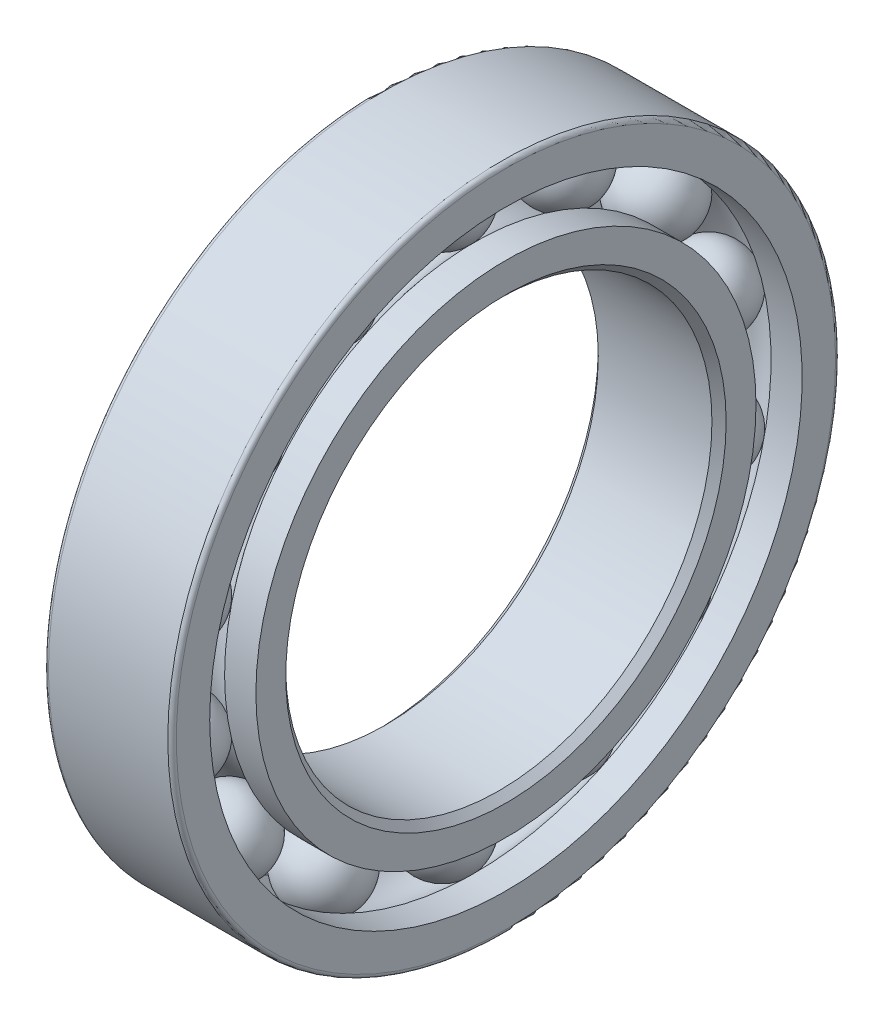
ISO-10303-21;
HEADER;
FILE_DESCRIPTION(('STEP AP214'),'2;1');
FILE_NAME('part.step','',(''),(''),'','','');
FILE_SCHEMA(('AUTOMOTIVE_DESIGN { 1 0 10303 214 1 1 1 1 }'));
ENDSEC;
DATA;
#1=APPLICATION_CONTEXT('core data for automotive mechanical design processes');
#2=APPLICATION_PROTOCOL_DEFINITION('international standard','automotive_design',2000,#1);
#3=PRODUCT_CONTEXT('',#1,'mechanical');
#4=PRODUCT('Part','Part','',(#3));
#5=PRODUCT_RELATED_PRODUCT_CATEGORY('part','',(#4));
#6=PRODUCT_DEFINITION_FORMATION('','',#4);
#7=PRODUCT_DEFINITION_CONTEXT('part definition',#1,'design');
#8=PRODUCT_DEFINITION('design','',#6,#7);
#9=PRODUCT_DEFINITION_SHAPE('','',#8);
#10=(LENGTH_UNIT() NAMED_UNIT(*) SI_UNIT(.MILLI.,.METRE.));
#11=(NAMED_UNIT(*) PLANE_ANGLE_UNIT() SI_UNIT($,.RADIAN.));
#12=(NAMED_UNIT(*) SI_UNIT($,.STERADIAN.) SOLID_ANGLE_UNIT());
#13=UNCERTAINTY_MEASURE_WITH_UNIT(LENGTH_MEASURE(1.E-05),#10,'distance_accuracy_value','');
#14=(GEOMETRIC_REPRESENTATION_CONTEXT(3) GLOBAL_UNCERTAINTY_ASSIGNED_CONTEXT((#13)) GLOBAL_UNIT_ASSIGNED_CONTEXT((#10,
#11,#12)) REPRESENTATION_CONTEXT('',''));
#15=CARTESIAN_POINT('',(0.,0.,0.));
#16=DIRECTION('',(0.,0.,1.));
#17=DIRECTION('',(1.,0.,0.));
#18=AXIS2_PLACEMENT_3D('',#15,#16,#17);
#19=CARTESIAN_POINT('',(0.,17.3346410184427,8.34792314062159));
#20=DIRECTION('',(-1.,0.,0.));
#21=DIRECTION('',(0.,0.900968867902425,0.433883739117546));
#22=AXIS2_PLACEMENT_3D('',#19,#20,#21);
#23=SPHERICAL_SURFACE('',#22,2.8);
#24=CARTESIAN_POINT('',(-2.8,17.3346410184427,8.34792314062159));
#25=VERTEX_POINT('',#24);
#26=VERTEX_LOOP('',#25);
#27=FACE_BOUND('',#26,.T.);
#28=ADVANCED_FACE('F38',(#27),#23,.T.);
#29=CLOSED_SHELL('',(#28));
#30=MANIFOLD_SOLID_BREP('B2',#29);
#31=CARTESIAN_POINT('',(0.,11.9959437877622,15.0424377226847));
#32=DIRECTION('',(-1.,0.,0.));
#33=DIRECTION('',(0.,0.623489801858743,0.781831482468022));
#34=AXIS2_PLACEMENT_3D('',#31,#32,#33);
#35=SPHERICAL_SURFACE('',#34,2.8);
#36=CARTESIAN_POINT('',(-2.8,11.9959437877622,15.0424377226847));
#37=VERTEX_POINT('',#36);
#38=VERTEX_LOOP('',#37);
#39=FACE_BOUND('',#38,.T.);
#40=ADVANCED_FACE('F57',(#39),#35,.T.);
#41=CLOSED_SHELL('',(#40));
#42=MANIFOLD_SOLID_BREP('B6',#41);
#43=CARTESIAN_POINT('',(0.,4.28130276931969,18.7576130303782));
#44=DIRECTION('',(-1.,0.,0.));
#45=DIRECTION('',(0.,0.222520933956325,0.974927912181821));
#46=AXIS2_PLACEMENT_3D('',#43,#44,#45);
#47=SPHERICAL_SURFACE('',#46,2.8);
#48=CARTESIAN_POINT('',(-2.8,4.28130276931969,18.7576130303782));
#49=VERTEX_POINT('',#48);
#50=VERTEX_LOOP('',#49);
#51=FACE_BOUND('',#50,.T.);
#52=ADVANCED_FACE('F76',(#51),#47,.T.);
#53=CLOSED_SHELL('',(#52));
#54=MANIFOLD_SOLID_BREP('B34',#53);
#55=CARTESIAN_POINT('',(0.,-4.28130276931931,18.7576130303783));
#56=DIRECTION('',(-1.,0.,0.));
#57=DIRECTION('',(0.,-0.222520933956305,0.974927912181826));
#58=AXIS2_PLACEMENT_3D('',#55,#56,#57);
#59=SPHERICAL_SURFACE('',#58,2.8);
#60=CARTESIAN_POINT('',(-2.8,-4.28130276931931,18.7576130303783));
#61=VERTEX_POINT('',#60);
#62=VERTEX_LOOP('',#61);
#63=FACE_BOUND('',#62,.T.);
#64=ADVANCED_FACE('F95',(#63),#59,.T.);
#65=CLOSED_SHELL('',(#64));
#66=MANIFOLD_SOLID_BREP('B53',#65);
#67=CARTESIAN_POINT('',(0.,-11.9959437877619,15.042437722685));
#68=DIRECTION('',(-1.,0.,0.));
#69=DIRECTION('',(0.,-0.623489801858727,0.781831482468035));
#70=AXIS2_PLACEMENT_3D('',#67,#68,#69);
#71=SPHERICAL_SURFACE('',#70,2.8);
#72=CARTESIAN_POINT('',(-2.8,-11.9959437877619,15.042437722685));
#73=VERTEX_POINT('',#72);
#74=VERTEX_LOOP('',#73);
#75=FACE_BOUND('',#74,.T.);
#76=ADVANCED_FACE('F114',(#75),#71,.T.);
#77=CLOSED_SHELL('',(#76));
#78=MANIFOLD_SOLID_BREP('B72',#77);
#79=CARTESIAN_POINT('',(0.,-17.3346410184425,8.34792314062195));
#80=DIRECTION('',(-1.,0.,0.));
#81=DIRECTION('',(0.,-0.900968867902416,0.433883739117565));
#82=AXIS2_PLACEMENT_3D('',#79,#80,#81);
#83=SPHERICAL_SURFACE('',#82,2.8);
#84=CARTESIAN_POINT('',(-2.8,-17.3346410184425,8.34792314062195));
#85=VERTEX_POINT('',#84);
#86=VERTEX_LOOP('',#85);
#87=FACE_BOUND('',#86,.T.);
#88=ADVANCED_FACE('F133',(#87),#83,.T.);
#89=CLOSED_SHELL('',(#88));
#90=MANIFOLD_SOLID_BREP('B91',#89);
#91=CARTESIAN_POINT('',(0.,-19.24,0.));
#92=DIRECTION('',(-1.,0.,0.));
#93=DIRECTION('',(0.,-1.,0.));
#94=AXIS2_PLACEMENT_3D('',#91,#92,#93);
#95=SPHERICAL_SURFACE('',#94,2.8);
#96=CARTESIAN_POINT('',(-2.8,-19.24,0.));
#97=VERTEX_POINT('',#96);
#98=VERTEX_LOOP('',#97);
#99=FACE_BOUND('',#98,.T.);
#100=ADVANCED_FACE('F152',(#99),#95,.T.);
#101=CLOSED_SHELL('',(#100));
#102=MANIFOLD_SOLID_BREP('B110',#101);
#103=CARTESIAN_POINT('',(0.,-17.3346410184426,-8.34792314062171));
#104=DIRECTION('',(-1.,0.,0.));
#105=DIRECTION('',(0.,-0.900968867902422,-0.433883739117553));
#106=AXIS2_PLACEMENT_3D('',#103,#104,#105);
#107=SPHERICAL_SURFACE('',#106,2.8);
#108=CARTESIAN_POINT('',(-2.8,-17.3346410184426,-8.34792314062171));
#109=VERTEX_POINT('',#108);
#110=VERTEX_LOOP('',#109);
#111=FACE_BOUND('',#110,.T.);
#112=ADVANCED_FACE('F171',(#111),#107,.T.);
#113=CLOSED_SHELL('',(#112));
#114=MANIFOLD_SOLID_BREP('B129',#113);
#115=CARTESIAN_POINT('',(0.,-11.9959437877621,-15.0424377226848));
#116=DIRECTION('',(-1.,0.,0.));
#117=DIRECTION('',(0.,-0.623489801858737,-0.781831482468027));
#118=AXIS2_PLACEMENT_3D('',#115,#116,#117);
#119=SPHERICAL_SURFACE('',#118,2.8);
#120=CARTESIAN_POINT('',(-2.8,-11.9959437877621,-15.0424377226848));
#121=VERTEX_POINT('',#120);
#122=VERTEX_LOOP('',#121);
#123=FACE_BOUND('',#122,.T.);
#124=ADVANCED_FACE('F190',(#123),#119,.T.);
#125=CLOSED_SHELL('',(#124));
#126=MANIFOLD_SOLID_BREP('B148',#125);
#127=CARTESIAN_POINT('',(0.,-4.28130276931956,-18.7576130303783));
#128=DIRECTION('',(-1.,0.,0.));
#129=DIRECTION('',(0.,-0.222520933956318,-0.974927912181823));
#130=AXIS2_PLACEMENT_3D('',#127,#128,#129);
#131=SPHERICAL_SURFACE('',#130,2.8);
#132=CARTESIAN_POINT('',(-2.8,-4.28130276931956,-18.7576130303783));
#133=VERTEX_POINT('',#132);
#134=VERTEX_LOOP('',#133);
#135=FACE_BOUND('',#134,.T.);
#136=ADVANCED_FACE('F209',(#135),#131,.T.);
#137=CLOSED_SHELL('',(#136));
#138=MANIFOLD_SOLID_BREP('B167',#137);
#139=CARTESIAN_POINT('',(0.,4.28130276931943,-18.7576130303783));
#140=DIRECTION('',(-1.,0.,0.));
#141=DIRECTION('',(0.,0.222520933956311,-0.974927912181824));
#142=AXIS2_PLACEMENT_3D('',#139,#140,#141);
#143=SPHERICAL_SURFACE('',#142,2.8);
#144=CARTESIAN_POINT('',(-2.8,4.28130276931943,-18.7576130303783));
#145=VERTEX_POINT('',#144);
#146=VERTEX_LOOP('',#145);
#147=FACE_BOUND('',#146,.T.);
#148=ADVANCED_FACE('F228',(#147),#143,.T.);
#149=CLOSED_SHELL('',(#148));
#150=MANIFOLD_SOLID_BREP('B186',#149);
#151=CARTESIAN_POINT('',(0.,11.995943787762,-15.0424377226849));
#152=DIRECTION('',(-1.,0.,0.));
#153=DIRECTION('',(0.,0.623489801858732,-0.781831482468031));
#154=AXIS2_PLACEMENT_3D('',#151,#152,#153);
#155=SPHERICAL_SURFACE('',#154,2.8);
#156=CARTESIAN_POINT('',(-2.8,11.995943787762,-15.0424377226849));
#157=VERTEX_POINT('',#156);
#158=VERTEX_LOOP('',#157);
#159=FACE_BOUND('',#158,.T.);
#160=ADVANCED_FACE('F247',(#159),#155,.T.);
#161=CLOSED_SHELL('',(#160));
#162=MANIFOLD_SOLID_BREP('B205',#161);
#163=CARTESIAN_POINT('',(0.,17.3346410184425,-8.34792314062184));
#164=DIRECTION('',(-1.,0.,0.));
#165=DIRECTION('',(0.,0.900968867902419,-0.433883739117559));
#166=AXIS2_PLACEMENT_3D('',#163,#164,#165);
#167=SPHERICAL_SURFACE('',#166,2.8);
#168=CARTESIAN_POINT('',(-2.8,17.3346410184425,-8.34792314062184));
#169=VERTEX_POINT('',#168);
#170=VERTEX_LOOP('',#169);
#171=FACE_BOUND('',#170,.T.);
#172=ADVANCED_FACE('F266',(#171),#167,.T.);
#173=CLOSED_SHELL('',(#172));
#174=MANIFOLD_SOLID_BREP('B224',#173);
#175=CARTESIAN_POINT('',(0.,19.24,0.));
#176=DIRECTION('',(-1.,0.,0.));
#177=DIRECTION('',(0.,1.,0.));
#178=AXIS2_PLACEMENT_3D('',#175,#176,#177);
#179=SPHERICAL_SURFACE('',#178,2.8);
#180=CARTESIAN_POINT('',(-2.8,19.24,0.));
#181=VERTEX_POINT('',#180);
#182=VERTEX_LOOP('',#181);
#183=FACE_BOUND('',#182,.T.);
#184=ADVANCED_FACE('F287',(#183),#179,.T.);
#185=CLOSED_SHELL('',(#184));
#186=MANIFOLD_SOLID_BREP('B243',#185);
#187=CARTESIAN_POINT('',(0.,0.,0.));
#188=DIRECTION('',(-1.,0.,0.));
#189=DIRECTION('',(0.,0.,1.));
#190=AXIS2_PLACEMENT_3D('',#187,#188,#189);
#191=TOROIDAL_SURFACE('',#190,19.2353066810408,2.81999075946427);
#192=CARTESIAN_POINT('',(2.29741592716843,0.,0.));
#193=DIRECTION('',(-1.,0.,0.));
#194=DIRECTION('',(0.,0.,1.));
#195=AXIS2_PLACEMENT_3D('',#192,#193,#194);
#196=CIRCLE('',#195,17.6);
#197=CARTESIAN_POINT('',(2.29741592716843,0.,17.6));
#198=VERTEX_POINT('',#197);
#199=EDGE_CURVE('E336',#198,#198,#196,.T.);
#200=ORIENTED_EDGE('',*,*,#199,.T.);
#201=EDGE_LOOP('',(#200));
#202=FACE_BOUND('',#201,.T.);
#203=CARTESIAN_POINT('',(-2.29741592716843,0.,0.));
#204=DIRECTION('',(-1.,0.,0.));
#205=DIRECTION('',(0.,0.,1.));
#206=AXIS2_PLACEMENT_3D('',#203,#204,#205);
#207=CIRCLE('',#206,17.6);
#208=CARTESIAN_POINT('',(-2.29741592716843,0.,17.6));
#209=VERTEX_POINT('',#208);
#210=EDGE_CURVE('E327',#209,#209,#207,.T.);
#211=ORIENTED_EDGE('',*,*,#210,.F.);
#212=EDGE_LOOP('',(#211));
#213=FACE_BOUND('',#212,.T.);
#214=ADVANCED_FACE('F307',(#202,#213),#191,.F.);
#215=CARTESIAN_POINT('',(-39.0340909090909,0.,0.));
#216=DIRECTION('',(-1.,0.,0.));
#217=DIRECTION('',(0.,0.,1.));
#218=AXIS2_PLACEMENT_3D('',#215,#216,#217);
#219=CYLINDRICAL_SURFACE('',#218,17.6);
#220=CARTESIAN_POINT('',(-4.5,0.,0.));
#221=DIRECTION('',(-1.,0.,0.));
#222=DIRECTION('',(0.,0.,1.));
#223=AXIS2_PLACEMENT_3D('',#220,#221,#222);
#224=CIRCLE('',#223,17.6);
#225=CARTESIAN_POINT('',(-4.5,0.,17.6));
#226=VERTEX_POINT('',#225);
#227=EDGE_CURVE('E330',#226,#226,#224,.T.);
#228=ORIENTED_EDGE('',*,*,#227,.F.);
#229=EDGE_LOOP('',(#228));
#230=FACE_BOUND('',#229,.T.);
#231=ORIENTED_EDGE('',*,*,#210,.T.);
#232=EDGE_LOOP('',(#231));
#233=FACE_BOUND('',#232,.T.);
#234=ADVANCED_FACE('F348',(#230,#233),#219,.T.);
#235=CARTESIAN_POINT('',(-4.5,0.,0.));
#236=DIRECTION('',(1.,0.,0.));
#237=DIRECTION('',(0.,0.,-1.));
#238=AXIS2_PLACEMENT_3D('',#235,#236,#237);
#239=PLANE('',#238);
#240=CARTESIAN_POINT('',(-4.5,0.,0.));
#241=DIRECTION('',(1.,0.,0.));
#242=DIRECTION('',(0.,0.,-1.));
#243=AXIS2_PLACEMENT_3D('',#240,#241,#242);
#244=CIRCLE('',#243,15.5);
#245=CARTESIAN_POINT('',(-4.5,0.,-15.5));
#246=VERTEX_POINT('',#245);
#247=EDGE_CURVE('E286',#246,#246,#244,.T.);
#248=ORIENTED_EDGE('',*,*,#247,.T.);
#249=EDGE_LOOP('',(#248));
#250=FACE_BOUND('',#249,.T.);
#251=ORIENTED_EDGE('',*,*,#227,.T.);
#252=EDGE_LOOP('',(#251));
#253=FACE_BOUND('',#252,.T.);
#254=ADVANCED_FACE('F358',(#250,#253),#239,.F.);
#255=CARTESIAN_POINT('',(-39.0340909090909,0.,0.));
#256=DIRECTION('',(-1.,0.,0.));
#257=DIRECTION('',(0.,0.,1.));
#258=AXIS2_PLACEMENT_3D('',#255,#256,#257);
#259=CYLINDRICAL_SURFACE('',#258,15.);
#260=CARTESIAN_POINT('',(4.,0.,0.));
#261=DIRECTION('',(1.,0.,0.));
#262=DIRECTION('',(0.,0.,-1.));
#263=AXIS2_PLACEMENT_3D('',#260,#261,#262);
#264=CIRCLE('',#263,15.);
#265=CARTESIAN_POINT('',(4.,0.,-15.));
#266=VERTEX_POINT('',#265);
#267=EDGE_CURVE('E314',#266,#266,#264,.T.);
#268=ORIENTED_EDGE('',*,*,#267,.T.);
#269=EDGE_LOOP('',(#268));
#270=FACE_BOUND('',#269,.T.);
#271=CARTESIAN_POINT('',(-4.00000000000002,0.,0.));
#272=DIRECTION('',(1.,0.,0.));
#273=DIRECTION('',(0.,0.,-1.));
#274=AXIS2_PLACEMENT_3D('',#271,#272,#273);
#275=CIRCLE('',#274,15.);
#276=CARTESIAN_POINT('',(-4.00000000000002,0.,-15.));
#277=VERTEX_POINT('',#276);
#278=EDGE_CURVE('E318',#277,#277,#275,.F.);
#279=ORIENTED_EDGE('',*,*,#278,.T.);
#280=EDGE_LOOP('',(#279));
#281=FACE_BOUND('',#280,.T.);
#282=ADVANCED_FACE('F352',(#270,#281),#259,.F.);
#283=CARTESIAN_POINT('',(4.5,0.,0.));
#284=DIRECTION('',(1.,0.,0.));
#285=DIRECTION('',(0.,0.,-1.));
#286=AXIS2_PLACEMENT_3D('',#283,#284,#285);
#287=PLANE('',#286);
#288=CARTESIAN_POINT('',(4.5,0.,0.));
#289=DIRECTION('',(1.,0.,0.));
#290=DIRECTION('',(0.,0.,-1.));
#291=AXIS2_PLACEMENT_3D('',#288,#289,#290);
#292=CIRCLE('',#291,15.5);
#293=CARTESIAN_POINT('',(4.5,0.,-15.5));
#294=VERTEX_POINT('',#293);
#295=EDGE_CURVE('E322',#294,#294,#292,.F.);
#296=ORIENTED_EDGE('',*,*,#295,.T.);
#297=EDGE_LOOP('',(#296));
#298=FACE_BOUND('',#297,.T.);
#299=CARTESIAN_POINT('',(4.5,0.,0.));
#300=DIRECTION('',(-1.,0.,0.));
#301=DIRECTION('',(0.,0.,1.));
#302=AXIS2_PLACEMENT_3D('',#299,#300,#301);
#303=CIRCLE('',#302,17.6);
#304=CARTESIAN_POINT('',(4.5,0.,17.6));
#305=VERTEX_POINT('',#304);
#306=EDGE_CURVE('E333',#305,#305,#303,.T.);
#307=ORIENTED_EDGE('',*,*,#306,.F.);
#308=EDGE_LOOP('',(#307));
#309=FACE_BOUND('',#308,.T.);
#310=ADVANCED_FACE('F346',(#298,#309),#287,.T.);
#311=ORIENTED_EDGE('',*,*,#199,.F.);
#312=EDGE_LOOP('',(#311));
#313=FACE_BOUND('',#312,.T.);
#314=ORIENTED_EDGE('',*,*,#306,.T.);
#315=EDGE_LOOP('',(#314));
#316=FACE_BOUND('',#315,.T.);
#317=ADVANCED_FACE('F342',(#313,#316),#219,.T.);
#318=CARTESIAN_POINT('',(4.5,0.,0.));
#319=DIRECTION('',(1.,0.,0.));
#320=DIRECTION('',(0.,0.,-1.));
#321=AXIS2_PLACEMENT_3D('',#318,#319,#320);
#322=CONICAL_SURFACE('',#321,15.5,0.785398163397443);
#323=ORIENTED_EDGE('',*,*,#267,.F.);
#324=EDGE_LOOP('',(#323));
#325=FACE_BOUND('',#324,.T.);
#326=ORIENTED_EDGE('',*,*,#295,.F.);
#327=EDGE_LOOP('',(#326));
#328=FACE_BOUND('',#327,.T.);
#329=ADVANCED_FACE('F345',(#325,#328),#322,.F.);
#330=CARTESIAN_POINT('',(-4.00000000000002,0.,0.));
#331=DIRECTION('',(-1.,0.,0.));
#332=DIRECTION('',(0.,0.,1.));
#333=AXIS2_PLACEMENT_3D('',#330,#331,#332);
#334=CONICAL_SURFACE('',#333,15.,0.78539816339745);
#335=ORIENTED_EDGE('',*,*,#247,.F.);
#336=EDGE_LOOP('',(#335));
#337=FACE_BOUND('',#336,.T.);
#338=ORIENTED_EDGE('',*,*,#278,.F.);
#339=EDGE_LOOP('',(#338));
#340=FACE_BOUND('',#339,.T.);
#341=ADVANCED_FACE('F309',(#337,#340),#334,.F.);
#342=CLOSED_SHELL('',(#214,#234,#254,#282,#310,#317,#329,#341));
#343=MANIFOLD_SOLID_BREP('B262',#342);
#344=CARTESIAN_POINT('',(0.,0.,0.));
#345=DIRECTION('',(-1.,0.,0.));
#346=DIRECTION('',(0.,0.,1.));
#347=AXIS2_PLACEMENT_3D('',#344,#345,#346);
#348=TOROIDAL_SURFACE('',#347,19.2353066810408,2.81999075946427);
#349=CARTESIAN_POINT('',(-2.31195012255291,0.,0.));
#350=DIRECTION('',(-1.,0.,0.));
#351=DIRECTION('',(0.,0.,1.));
#352=AXIS2_PLACEMENT_3D('',#349,#350,#351);
#353=CIRCLE('',#352,20.85);
#354=CARTESIAN_POINT('',(-2.31195012255291,0.,20.85));
#355=VERTEX_POINT('',#354);
#356=EDGE_CURVE('E457',#355,#355,#353,.T.);
#357=ORIENTED_EDGE('',*,*,#356,.T.);
#358=EDGE_LOOP('',(#357));
#359=FACE_BOUND('',#358,.T.);
#360=CARTESIAN_POINT('',(2.31195012255291,0.,0.));
#361=DIRECTION('',(-1.,0.,0.));
#362=DIRECTION('',(0.,0.,1.));
#363=AXIS2_PLACEMENT_3D('',#360,#361,#362);
#364=CIRCLE('',#363,20.85);
#365=CARTESIAN_POINT('',(2.31195012255291,0.,20.85));
#366=VERTEX_POINT('',#365);
#367=EDGE_CURVE('E448',#366,#366,#364,.T.);
#368=ORIENTED_EDGE('',*,*,#367,.F.);
#369=EDGE_LOOP('',(#368));
#370=FACE_BOUND('',#369,.T.);
#371=ADVANCED_FACE('F428',(#359,#370),#348,.F.);
#372=CARTESIAN_POINT('',(-39.0340909090909,0.,0.));
#373=DIRECTION('',(-1.,0.,0.));
#374=DIRECTION('',(0.,0.,1.));
#375=AXIS2_PLACEMENT_3D('',#372,#373,#374);
#376=CYLINDRICAL_SURFACE('',#375,20.85);
#377=ORIENTED_EDGE('',*,*,#367,.T.);
#378=EDGE_LOOP('',(#377));
#379=FACE_BOUND('',#378,.T.);
#380=CARTESIAN_POINT('',(4.5,0.,0.));
#381=DIRECTION('',(-1.,0.,0.));
#382=DIRECTION('',(0.,0.,1.));
#383=AXIS2_PLACEMENT_3D('',#380,#381,#382);
#384=CIRCLE('',#383,20.85);
#385=CARTESIAN_POINT('',(4.5,0.,20.85));
#386=VERTEX_POINT('',#385);
#387=EDGE_CURVE('E451',#386,#386,#384,.T.);
#388=ORIENTED_EDGE('',*,*,#387,.F.);
#389=EDGE_LOOP('',(#388));
#390=FACE_BOUND('',#389,.T.);
#391=ADVANCED_FACE('F469',(#379,#390),#376,.F.);
#392=CARTESIAN_POINT('',(4.5,0.,0.));
#393=DIRECTION('',(1.,0.,0.));
#394=DIRECTION('',(0.,0.,-1.));
#395=AXIS2_PLACEMENT_3D('',#392,#393,#394);
#396=PLANE('',#395);
#397=CARTESIAN_POINT('',(4.5,0.,0.));
#398=DIRECTION('',(1.,0.,0.));
#399=DIRECTION('',(0.,0.,-1.));
#400=AXIS2_PLACEMENT_3D('',#397,#398,#399);
#401=CIRCLE('',#400,23.2);
#402=CARTESIAN_POINT('',(4.5,0.,-23.2));
#403=VERTEX_POINT('',#402);
#404=EDGE_CURVE('E435',#403,#403,#401,.T.);
#405=ORIENTED_EDGE('',*,*,#404,.T.);
#406=EDGE_LOOP('',(#405));
#407=FACE_BOUND('',#406,.T.);
#408=ORIENTED_EDGE('',*,*,#387,.T.);
#409=EDGE_LOOP('',(#408));
#410=FACE_BOUND('',#409,.T.);
#411=ADVANCED_FACE('F478',(#407,#410),#396,.T.);
#412=CARTESIAN_POINT('',(-39.0340909090909,0.,0.));
#413=DIRECTION('',(-1.,0.,0.));
#414=DIRECTION('',(0.,0.,1.));
#415=AXIS2_PLACEMENT_3D('',#412,#413,#414);
#416=CYLINDRICAL_SURFACE('',#415,23.5);
#417=CARTESIAN_POINT('',(4.2,0.,0.));
#418=DIRECTION('',(1.,0.,0.));
#419=DIRECTION('',(0.,0.,-1.));
#420=AXIS2_PLACEMENT_3D('',#417,#418,#419);
#421=CIRCLE('',#420,23.5);
#422=CARTESIAN_POINT('',(4.2,0.,-23.5));
#423=VERTEX_POINT('',#422);
#424=EDGE_CURVE('E439',#423,#423,#421,.F.);
#425=ORIENTED_EDGE('',*,*,#424,.T.);
#426=EDGE_LOOP('',(#425));
#427=FACE_BOUND('',#426,.T.);
#428=CARTESIAN_POINT('',(-4.2,0.,0.));
#429=DIRECTION('',(1.,0.,0.));
#430=DIRECTION('',(0.,0.,-1.));
#431=AXIS2_PLACEMENT_3D('',#428,#429,#430);
#432=CIRCLE('',#431,23.5);
#433=CARTESIAN_POINT('',(-4.2,0.,-23.5));
#434=VERTEX_POINT('',#433);
#435=EDGE_CURVE('E443',#434,#434,#432,.T.);
#436=ORIENTED_EDGE('',*,*,#435,.T.);
#437=EDGE_LOOP('',(#436));
#438=FACE_BOUND('',#437,.T.);
#439=ADVANCED_FACE('F475',(#427,#438),#416,.T.);
#440=CARTESIAN_POINT('',(-4.5,0.,0.));
#441=DIRECTION('',(1.,0.,0.));
#442=DIRECTION('',(0.,0.,-1.));
#443=AXIS2_PLACEMENT_3D('',#440,#441,#442);
#444=PLANE('',#443);
#445=CARTESIAN_POINT('',(-4.5,0.,0.));
#446=DIRECTION('',(1.,0.,0.));
#447=DIRECTION('',(0.,0.,-1.));
#448=AXIS2_PLACEMENT_3D('',#445,#446,#447);
#449=CIRCLE('',#448,23.2);
#450=CARTESIAN_POINT('',(-4.5,0.,-23.2));
#451=VERTEX_POINT('',#450);
#452=EDGE_CURVE('E306',#451,#451,#449,.F.);
#453=ORIENTED_EDGE('',*,*,#452,.T.);
#454=EDGE_LOOP('',(#453));
#455=FACE_BOUND('',#454,.T.);
#456=CARTESIAN_POINT('',(-4.5,0.,0.));
#457=DIRECTION('',(-1.,0.,0.));
#458=DIRECTION('',(0.,0.,1.));
#459=AXIS2_PLACEMENT_3D('',#456,#457,#458);
#460=CIRCLE('',#459,20.85);
#461=CARTESIAN_POINT('',(-4.5,0.,20.85));
#462=VERTEX_POINT('',#461);
#463=EDGE_CURVE('E454',#462,#462,#460,.T.);
#464=ORIENTED_EDGE('',*,*,#463,.F.);
#465=EDGE_LOOP('',(#464));
#466=FACE_BOUND('',#465,.T.);
#467=ADVANCED_FACE('F466',(#455,#466),#444,.F.);
#468=ORIENTED_EDGE('',*,*,#463,.T.);
#469=EDGE_LOOP('',(#468));
#470=FACE_BOUND('',#469,.T.);
#471=ORIENTED_EDGE('',*,*,#356,.F.);
#472=EDGE_LOOP('',(#471));
#473=FACE_BOUND('',#472,.T.);
#474=ADVANCED_FACE('F463',(#470,#473),#376,.F.);
#475=CARTESIAN_POINT('',(4.2,0.,0.));
#476=DIRECTION('',(1.,0.,0.));
#477=DIRECTION('',(0.,0.,-1.));
#478=AXIS2_PLACEMENT_3D('',#475,#476,#477);
#479=TOROIDAL_SURFACE('',#478,23.2,0.3);
#480=ORIENTED_EDGE('',*,*,#404,.F.);
#481=EDGE_LOOP('',(#480));
#482=FACE_BOUND('',#481,.T.);
#483=ORIENTED_EDGE('',*,*,#424,.F.);
#484=EDGE_LOOP('',(#483));
#485=FACE_BOUND('',#484,.T.);
#486=ADVANCED_FACE('F465',(#482,#485),#479,.T.);
#487=CARTESIAN_POINT('',(-4.2,0.,0.));
#488=DIRECTION('',(1.,0.,0.));
#489=DIRECTION('',(0.,0.,-1.));
#490=AXIS2_PLACEMENT_3D('',#487,#488,#489);
#491=TOROIDAL_SURFACE('',#490,23.2,0.3);
#492=ORIENTED_EDGE('',*,*,#435,.F.);
#493=EDGE_LOOP('',(#492));
#494=FACE_BOUND('',#493,.T.);
#495=ORIENTED_EDGE('',*,*,#452,.F.);
#496=EDGE_LOOP('',(#495));
#497=FACE_BOUND('',#496,.T.);
#498=ADVANCED_FACE('F430',(#494,#497),#491,.T.);
#499=CLOSED_SHELL('',(#371,#391,#411,#439,#467,#474,#486,#498));
#500=MANIFOLD_SOLID_BREP('B281',#499);
#501=ADVANCED_BREP_SHAPE_REPRESENTATION('',(#18,#30,#42,#54,#66,#78,#90,#102,#114,#126,#138,
#150,#162,#174,#186,#343,#500),#14);
#502=SHAPE_DEFINITION_REPRESENTATION(#9,#501);
ENDSEC;
END-ISO-10303-21;
